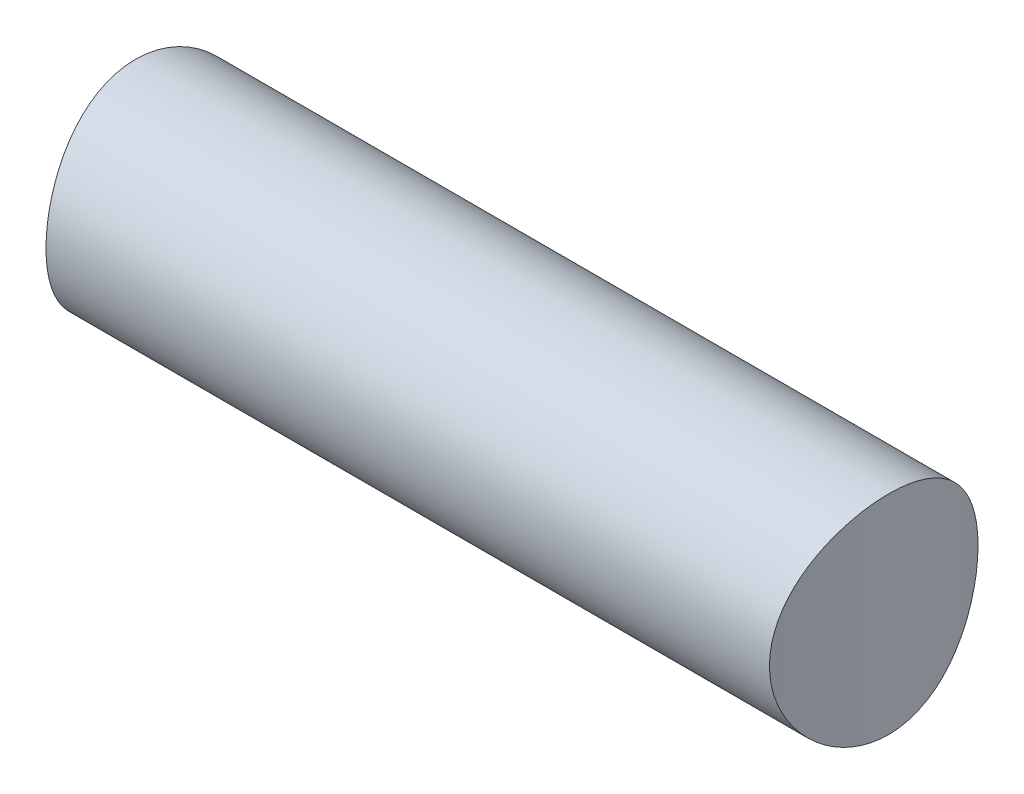
ISO-10303-21;
HEADER;
FILE_DESCRIPTION(('STEP AP214'),'2;1');
FILE_NAME('part.step','',(''),(''),'','','');
FILE_SCHEMA(('AUTOMOTIVE_DESIGN { 1 0 10303 214 1 1 1 1 }'));
ENDSEC;
DATA;
#1=APPLICATION_CONTEXT('core data for automotive mechanical design processes');
#2=APPLICATION_PROTOCOL_DEFINITION('international standard','automotive_design',2000,#1);
#3=PRODUCT_CONTEXT('',#1,'mechanical');
#4=PRODUCT('Part','Part','',(#3));
#5=PRODUCT_RELATED_PRODUCT_CATEGORY('part','',(#4));
#6=PRODUCT_DEFINITION_FORMATION('','',#4);
#7=PRODUCT_DEFINITION_CONTEXT('part definition',#1,'design');
#8=PRODUCT_DEFINITION('design','',#6,#7);
#9=PRODUCT_DEFINITION_SHAPE('','',#8);
#10=(LENGTH_UNIT() NAMED_UNIT(*) SI_UNIT(.MILLI.,.METRE.));
#11=(NAMED_UNIT(*) PLANE_ANGLE_UNIT() SI_UNIT($,.RADIAN.));
#12=(NAMED_UNIT(*) SI_UNIT($,.STERADIAN.) SOLID_ANGLE_UNIT());
#13=UNCERTAINTY_MEASURE_WITH_UNIT(LENGTH_MEASURE(1.E-05),#10,'distance_accuracy_value','');
#14=(GEOMETRIC_REPRESENTATION_CONTEXT(3) GLOBAL_UNCERTAINTY_ASSIGNED_CONTEXT((#13)) GLOBAL_UNIT_ASSIGNED_CONTEXT((#10,
#11,#12)) REPRESENTATION_CONTEXT('',''));
#15=CARTESIAN_POINT('',(0.,0.,0.));
#16=DIRECTION('',(0.,0.,1.));
#17=DIRECTION('',(1.,0.,0.));
#18=AXIS2_PLACEMENT_3D('',#15,#16,#17);
#19=CARTESIAN_POINT('',(0.,10.,0.));
#20=DIRECTION('',(0.,-1.,0.));
#21=DIRECTION('',(0.,0.,-1.));
#22=AXIS2_PLACEMENT_3D('',#19,#20,#21);
#23=CYLINDRICAL_SURFACE('',#22,6.86);
#24=CARTESIAN_POINT('',(6.59163105763665,6.,-1.9));
#25=CARTESIAN_POINT('',(6.59163270097938,5.89549675411097,-1.89999780628826));
#26=CARTESIAN_POINT('',(6.59414341831588,5.7909708853803,-1.89134884865616));
#27=CARTESIAN_POINT('',(6.60388204192961,5.58494893804559,-1.85705400342647));
#28=CARTESIAN_POINT('',(6.6111120741906,5.48345424650295,-1.83140045542376));
#29=CARTESIAN_POINT('',(6.62940905108194,5.28650524318556,-1.76401334032314));
#30=CARTESIAN_POINT('',(6.6404703083978,5.19104222460376,-1.72230359789532));
#31=CARTESIAN_POINT('',(6.66517603251171,5.00845102712002,-1.62406390289956));
#32=CARTESIAN_POINT('',(6.67882075710892,4.92132368132588,-1.56753247108727));
#33=CARTESIAN_POINT('',(6.70756858012531,4.75552676553505,-1.43962274245214));
#34=CARTESIAN_POINT('',(6.7226991343505,4.67711535735927,-1.36791591481302));
#35=CARTESIAN_POINT('',(6.75247755188823,4.53326339121352,-1.21239671623228));
#36=CARTESIAN_POINT('',(6.76712536162435,4.46782426893138,-1.12858300715263));
#37=CARTESIAN_POINT('',(6.79459590136706,4.35068474381495,-0.949425261970774));
#38=CARTESIAN_POINT('',(6.80738247729288,4.29924295270199,-0.853906110437325));
#39=CARTESIAN_POINT('',(6.82937364869001,4.21324824686219,-0.655160610743139));
#40=CARTESIAN_POINT('',(6.83857889765246,4.17869225065926,-0.551935672772083));
#41=CARTESIAN_POINT('',(6.85217605932241,4.12829116282743,-0.343405402984005));
#42=CARTESIAN_POINT('',(6.85668086978685,4.1120064594819,-0.238213815538595));
#43=CARTESIAN_POINT('',(6.86076516500632,4.09722505430859,-0.0265016647698278));
#44=CARTESIAN_POINT('',(6.86034553649985,4.09872514999138,0.0800186558392073));
#45=CARTESIAN_POINT('',(6.85471009137871,4.11916548160938,0.288297525531677));
#46=CARTESIAN_POINT('',(6.849624984268,4.13763044413227,0.390106799067252));
#47=CARTESIAN_POINT('',(6.8353855464955,4.19070600572513,0.589120842923308));
#48=CARTESIAN_POINT('',(6.82623097509955,4.22531755997258,0.686325340466112));
#49=CARTESIAN_POINT('',(6.80469128716685,4.31005522190625,0.874558845102859));
#50=CARTESIAN_POINT('',(6.79227331455028,4.36034014707596,0.965512442406674));
#51=CARTESIAN_POINT('',(6.76553875426084,4.47487422211408,1.13784960750763));
#52=CARTESIAN_POINT('',(6.75122177191448,4.53912627656617,1.21923117928734));
#53=CARTESIAN_POINT('',(6.72167678872466,4.68227692837269,1.37295156594626));
#54=CARTESIAN_POINT('',(6.7064343170473,4.76158936760136,1.44490268500078));
#55=CARTESIAN_POINT('',(6.67717923300929,4.93131036286249,1.57458209660795));
#56=CARTESIAN_POINT('',(6.66316670841156,5.02171970961299,1.63230937474825));
#57=CARTESIAN_POINT('',(6.63789645457466,5.21196166653103,1.73222908444405));
#58=CARTESIAN_POINT('',(6.62665900688494,5.31185666878068,1.77430821924232));
#59=CARTESIAN_POINT('',(6.60845913510955,5.51769375704647,1.84094388790987));
#60=CARTESIAN_POINT('',(6.60149555397248,5.62363419790225,1.86550516462979));
#61=CARTESIAN_POINT('',(6.59288062696182,5.83490971777278,1.89572300416723));
#62=CARTESIAN_POINT('',(6.59106590865885,5.94015503494451,1.90196118923126));
#63=CARTESIAN_POINT('',(6.59250574741807,6.15018660357655,1.89696476279126));
#64=CARTESIAN_POINT('',(6.59575971612763,6.25497290690154,1.88573217922338));
#65=CARTESIAN_POINT('',(6.60681170174123,6.4588170715195,1.84662747437641));
#66=CARTESIAN_POINT('',(6.61451216465538,6.55794921381925,1.8191122739205));
#67=CARTESIAN_POINT('',(6.6334924610799,6.75018936966331,1.7486283903445));
#68=CARTESIAN_POINT('',(6.64477278862129,6.84329654961018,1.70565757419839));
#69=CARTESIAN_POINT('',(6.66997157913765,7.02325705674668,1.60432481378773));
#70=CARTESIAN_POINT('',(6.68394574054422,7.10991234366487,1.54562534116918));
#71=CARTESIAN_POINT('',(6.71283011164992,7.27235616296461,1.41491460350266));
#72=CARTESIAN_POINT('',(6.7277405112528,7.34814248041269,1.34290063198415));
#73=CARTESIAN_POINT('',(6.75738542987701,7.48914967760174,1.18490152960302));
#74=CARTESIAN_POINT('',(6.7720996396994,7.55396290317516,1.09854798215039));
#75=CARTESIAN_POINT('',(6.79921537187427,7.6681778666128,0.91585239016395));
#76=CARTESIAN_POINT('',(6.81161701685985,7.71758042178379,0.81951087570438));
#77=CARTESIAN_POINT('',(6.83263049368621,7.79910695576067,0.620249738568718));
#78=CARTESIAN_POINT('',(6.8412708491535,7.83136140558953,0.517386652763912));
#79=CARTESIAN_POINT('',(6.85391403669584,7.87804407943939,0.307422992357073));
#80=CARTESIAN_POINT('',(6.85791798400952,7.89247659039358,0.200323443203792));
#81=CARTESIAN_POINT('',(6.86077997901154,7.90281971278765,-0.0112774013646374));
#82=CARTESIAN_POINT('',(6.85980356534407,7.89932613314726,-0.115747730555198));
#83=CARTESIAN_POINT('',(6.85319361290781,7.87531181114767,-0.322553980106251));
#84=CARTESIAN_POINT('',(6.84756027413939,7.85479180002033,-0.424889991935499));
#85=CARTESIAN_POINT('',(6.83230676456834,7.79765427813502,-0.623746394347944));
#86=CARTESIAN_POINT('',(6.82271864281594,7.76116603012611,-0.720306548859288));
#87=CARTESIAN_POINT('',(6.80055423780643,7.67324279470518,-0.905988635035887));
#88=CARTESIAN_POINT('',(6.78797751124361,7.62180558963186,-0.995109460558028));
#89=CARTESIAN_POINT('',(6.76073030042571,7.5037480447488,-1.16612234258723));
#90=CARTESIAN_POINT('',(6.74601059279286,7.43673883932652,-1.24773807033925));
#91=CARTESIAN_POINT('',(6.71632236064186,7.29016573251289,-1.39876744784632));
#92=CARTESIAN_POINT('',(6.7013537699788,7.21059844429374,-1.46817779518797));
#93=CARTESIAN_POINT('',(6.67244181840861,7.03884859934578,-1.59449986510806));
#94=CARTESIAN_POINT('',(6.65853210755754,6.94640698406785,-1.6510678073558));
#95=CARTESIAN_POINT('',(6.63380474676701,6.75295143548739,-1.74778214191845));
#96=CARTESIAN_POINT('',(6.62298522889167,6.65194272885392,-1.78793846095776));
#97=CARTESIAN_POINT('',(6.60703983247777,6.45953877823046,-1.8459108661542));
#98=CARTESIAN_POINT('',(6.60131052528726,6.36891515353853,-1.86614432976177));
#99=CARTESIAN_POINT('',(6.5936056637571,6.18553343452971,-1.8931889573846));
#100=CARTESIAN_POINT('',(6.59162959871391,6.09277563234899,-1.90000194752796));
#101=CARTESIAN_POINT('',(6.59163105763665,6.,-1.9));
#102=B_SPLINE_CURVE_WITH_KNOTS('',3,(#24,#25,#26,#27,#28,#29,#30,#31,#32,#33,#34,#35,#36,#37,
#38,#39,#40,#41,#42,#43,#44,#45,#46,#47,#48,#49,#50,#51,#52,#53,#54,#55,#56,#57,#58,#59,#60,#61,
#62,#63,#64,#65,#66,#67,#68,#69,#70,#71,#72,#73,#74,#75,#76,#77,#78,#79,#80,#81,#82,#83,#84,#85,
#86,#87,#88,#89,#90,#91,#92,#93,#94,#95,#96,#97,#98,#99,#100,#101),.UNSPECIFIED.,.T.,.F.,(4,2,2,
2,2,2,2,2,2,2,2,2,2,2,2,2,2,2,2,2,2,2,2,2,2,2,2,2,2,2,2,2,2,2,2,2,2,2,4),(0.,0.313168277823112,
0.626477730923763,0.93932406684453,1.25220163756171,1.57271145041281,1.89325671541606,
2.21937437720849,2.54543250378664,2.86346508879143,3.18144040688391,3.4907705752359,
3.80011904482995,4.11271003785846,4.42536609914521,4.74835412980139,5.07136518857512,
5.39667138983629,5.72188948300805,6.03666640281582,6.35140678731896,6.65949096415014,
6.96761767593369,7.28297539960527,7.59839729742632,7.92374766215918,8.24908076896101,
8.57190181710273,8.89464519793624,9.20673247669843,9.51880635298403,9.82839941845738,
10.1380384351849,10.4564497861005,10.7749471575488,11.1011655015915,11.4271862363352,
11.7052478315532,11.9832715882271),.UNSPECIFIED.);
#103=CARTESIAN_POINT('',(6.59163105763665,6.,-1.9));
#104=VERTEX_POINT('',#103);
#105=EDGE_CURVE('E42',#104,#104,#102,.T.);
#106=ORIENTED_EDGE('',*,*,#105,.F.);
#107=EDGE_LOOP('',(#106));
#108=FACE_BOUND('',#107,.T.);
#109=ADVANCED_FACE('F32',(#108),#23,.T.);
#110=CARTESIAN_POINT('',(-6.86,6.,0.));
#111=DIRECTION('',(1.,0.,0.));
#112=DIRECTION('',(0.,0.,-1.));
#113=AXIS2_PLACEMENT_3D('',#110,#111,#112);
#114=CYLINDRICAL_SURFACE('',#113,1.9);
#115=ORIENTED_EDGE('',*,*,#105,.T.);
#116=EDGE_LOOP('',(#115));
#117=FACE_BOUND('',#116,.T.);
#118=CARTESIAN_POINT('',(-6.86,4.1,0.));
#119=CARTESIAN_POINT('',(-6.85999858722013,4.10000215504828,-0.104590051644699));
#120=CARTESIAN_POINT('',(-6.85758472968204,4.10866498620979,-0.209202657619853));
#121=CARTESIAN_POINT('',(-6.8481901851718,4.14301992445033,-0.415404417640272));
#122=CARTESIAN_POINT('',(-6.8412075515675,4.16871929039841,-0.516992263618734));
#123=CARTESIAN_POINT('',(-6.8234445033766,4.23624026468239,-0.714139011354305));
#124=CARTESIAN_POINT('',(-6.81266920064352,4.27804017941767,-0.809705825004333));
#125=CARTESIAN_POINT('',(-6.78845392404178,4.37649270058396,-0.992473341961966));
#126=CARTESIAN_POINT('',(-6.77501371792442,4.43314660169192,-1.0796733151084));
#127=CARTESIAN_POINT('',(-6.74654111169647,4.56118433302339,-1.24539847034133));
#128=CARTESIAN_POINT('',(-6.73147983831169,4.6328690947818,-1.32368619444255));
#129=CARTESIAN_POINT('',(-6.70164397271748,4.78829098807034,-1.46729655045726));
#130=CARTESIAN_POINT('',(-6.68686942083691,4.87202980131994,-1.5326173702645));
#131=CARTESIAN_POINT('',(-6.65898156473122,5.0511118394496,-1.64962447348145));
#132=CARTESIAN_POINT('',(-6.64590453286827,5.14664293922237,-1.70103265478104));
#133=CARTESIAN_POINT('',(-6.62331899462443,5.34541375563565,-1.78696204001153));
#134=CARTESIAN_POINT('',(-6.61380977231891,5.4486519207688,-1.82148663226352));
#135=CARTESIAN_POINT('',(-6.59973545955365,5.65726504706799,-1.87183470279574));
#136=CARTESIAN_POINT('',(-6.59505618383984,5.76252766827778,-1.88809093257662));
#137=CARTESIAN_POINT('',(-6.59083083561345,5.9743820548923,-1.90279069419079));
#138=CARTESIAN_POINT('',(-6.59128372148095,6.08097354620381,-1.90123784054244));
#139=CARTESIAN_POINT('',(-6.59716962175827,6.28904128179645,-1.88070597927332));
#140=CARTESIAN_POINT('',(-6.60245144980221,6.39057469158811,-1.86225596431995));
#141=CARTESIAN_POINT('',(-6.61715728367617,6.5890451553746,-1.80930296288052));
#142=CARTESIAN_POINT('',(-6.62658164371479,6.68598181553738,-1.77479860364752));
#143=CARTESIAN_POINT('',(-6.6486398845323,6.87386053786348,-1.69029784515122));
#144=CARTESIAN_POINT('',(-6.66131099123597,6.96471651405561,-1.64012017193757));
#145=CARTESIAN_POINT('',(-6.68841563689987,7.1369021594991,-1.52582343983807));
#146=CARTESIAN_POINT('',(-6.70284954691815,7.21822981602115,-1.4617014435425));
#147=CARTESIAN_POINT('',(-6.73247800957591,7.37206631687515,-1.31865447859891));
#148=CARTESIAN_POINT('',(-6.74768142484504,7.44416239704761,-1.23928678317623));
#149=CARTESIAN_POINT('',(-6.77668047203929,7.57410941270837,-1.06940013419599));
#150=CARTESIAN_POINT('',(-6.7904760394699,7.63195969575803,-0.978880670186914));
#151=CARTESIAN_POINT('',(-6.81520125662484,7.731974731343,-0.788587977277973));
#152=CARTESIAN_POINT('',(-6.82611626643624,7.7740597971169,-0.688770838622147));
#153=CARTESIAN_POINT('',(-6.84374494155507,7.84073002233952,-0.483105675456709));
#154=CARTESIAN_POINT('',(-6.85045959972833,7.86531931757214,-0.377259082629433));
#155=CARTESIAN_POINT('',(-6.85877879513228,7.89564034544386,-0.166058115938683));
#156=CARTESIAN_POINT('',(-6.86053520603365,7.9019327098639,-0.0607900890122599));
#157=CARTESIAN_POINT('',(-6.85917930234349,7.89703638597928,0.149298898700573));
#158=CARTESIAN_POINT('',(-6.85606753384992,7.8858496584276,0.254119908309473));
#159=CARTESIAN_POINT('',(-6.8454234520855,7.84677081735517,0.458304190722703));
#160=CARTESIAN_POINT('',(-6.83797511131397,7.81919583738113,0.557732942702119));
#161=CARTESIAN_POINT('',(-6.81950712788993,7.74849544852237,0.750540304471289));
#162=CARTESIAN_POINT('',(-6.80848708360198,7.70536829074524,0.843918232432691));
#163=CARTESIAN_POINT('',(-6.78374768908357,7.60377764838176,1.02411755100512));
#164=CARTESIAN_POINT('',(-6.76997716023722,7.54501503058521,1.11076309378323));
#165=CARTESIAN_POINT('',(-6.74132611784192,7.41419369268489,1.27315882902037));
#166=CARTESIAN_POINT('',(-6.72644536764872,7.3421321330537,1.34890668849919));
#167=CARTESIAN_POINT('',(-6.6966847795064,7.18413540507006,1.48975185473358));
#168=CARTESIAN_POINT('',(-6.68181889889888,7.09784322462368,1.55445239962449));
#169=CARTESIAN_POINT('',(-6.65426668025668,6.91530817834538,1.66846885738791));
#170=CARTESIAN_POINT('',(-6.64158025820717,6.81906569631164,1.71778536335154));
#171=CARTESIAN_POINT('',(-6.61997113597432,6.61980395240326,1.79926660435887));
#172=CARTESIAN_POINT('',(-6.61102752601089,6.51682615969282,1.83152690056647));
#173=CARTESIAN_POINT('',(-6.59792603433667,6.3066142873145,1.87818276922649));
#174=CARTESIAN_POINT('',(-6.59376681036886,6.19938141014632,1.89258335230091));
#175=CARTESIAN_POINT('',(-6.59082329224871,5.98778235393528,1.90280649427529));
#176=CARTESIAN_POINT('',(-6.59185376034659,5.88344923887526,1.89926928213049));
#177=CARTESIAN_POINT('',(-6.59873633233529,5.67692939446989,1.8752151931377));
#178=CARTESIAN_POINT('',(-6.60458829305325,5.57474260148252,1.85469882048099));
#179=CARTESIAN_POINT('',(-6.62033988698841,5.37629319509305,1.79765314739266));
#180=CARTESIAN_POINT('',(-6.63020262837255,5.27998555224959,1.76126958084547));
#181=CARTESIAN_POINT('',(-6.65286291305646,5.09476672097632,1.67363505073891));
#182=CARTESIAN_POINT('',(-6.66566094888751,5.00585677726822,1.62238159168516));
#183=CARTESIAN_POINT('',(-6.69325408710002,4.83492613671386,1.50456451451755));
#184=CARTESIAN_POINT('',(-6.70809945951598,4.75321131550898,1.43756886061848));
#185=CARTESIAN_POINT('',(-6.73784542874088,4.60197603627264,1.29097764936374));
#186=CARTESIAN_POINT('',(-6.75274603830982,4.53245860169153,1.21137897728674));
#187=CARTESIAN_POINT('',(-6.78134497060899,4.40596959400253,1.03957286790152));
#188=CARTESIAN_POINT('',(-6.79500656912608,4.34933324686454,0.947111959286699));
#189=CARTESIAN_POINT('',(-6.8191759559901,4.25249580355508,0.753603834901252));
#190=CARTESIAN_POINT('',(-6.82968560874114,4.2122849864191,0.652561740549612));
#191=CARTESIAN_POINT('',(-6.84513687391659,4.15420547290522,0.460028973312807));
#192=CARTESIAN_POINT('',(-6.85066836016857,4.13392787245503,0.369305327576373));
#193=CARTESIAN_POINT('',(-6.85810033896638,4.10682496275222,0.185726882762707));
#194=CARTESIAN_POINT('',(-6.86000125449946,4.09999808639197,0.0928723332267212));
#195=CARTESIAN_POINT('',(-6.86,4.1,0.));
#196=B_SPLINE_CURVE_WITH_KNOTS('',3,(#118,#119,#120,#121,#122,#123,#124,#125,#126,#127,#128,
#129,#130,#131,#132,#133,#134,#135,#136,#137,#138,#139,#140,#141,#142,#143,#144,#145,#146,#147,
#148,#149,#150,#151,#152,#153,#154,#155,#156,#157,#158,#159,#160,#161,#162,#163,#164,#165,#166,
#167,#168,#169,#170,#171,#172,#173,#174,#175,#176,#177,#178,#179,#180,#181,#182,#183,#184,#185,
#186,#187,#188,#189,#190,#191,#192,#193,#194,#195),.UNSPECIFIED.,.T.,.F.,(4,2,2,2,2,2,2,2,2,2,2,
2,2,2,2,2,2,2,2,2,2,2,2,2,2,2,2,2,2,2,2,2,2,2,2,2,2,2,4),(0.,0.313429405719025,
0.626992442285331,0.940134459043744,1.2533037784121,1.57347288183003,1.89368669697049,
2.21989437039137,2.5460365511978,2.86427836299605,3.18245558581578,3.49100012854605,
3.79957105861571,4.11185195477011,4.42419869757955,4.74757382251473,5.07096375484932,
5.39596691548485,5.72089322384332,6.03575285922103,6.35057717710925,6.65949900367715,
6.96845558033656,7.28381099648506,7.59923382390198,7.92430709764513,8.24936783749454,
8.57258751850877,8.89571649827472,9.20739542830542,9.51906510345212,9.82793059416972,
10.1368479493102,10.4555121097206,10.7742551483642,11.100529085026,11.4266096453599,
11.7049565029329,11.983270929145),.UNSPECIFIED.);
#197=CARTESIAN_POINT('',(-6.86,4.1,0.));
#198=VERTEX_POINT('',#197);
#199=EDGE_CURVE('E11',#198,#198,#196,.T.);
#200=ORIENTED_EDGE('',*,*,#199,.T.);
#201=EDGE_LOOP('',(#200));
#202=FACE_BOUND('',#201,.T.);
#203=ADVANCED_FACE('F50',(#117,#202),#114,.T.);
#204=ORIENTED_EDGE('',*,*,#199,.F.);
#205=EDGE_LOOP('',(#204));
#206=FACE_BOUND('',#205,.T.);
#207=ADVANCED_FACE('F34',(#206),#23,.T.);
#208=CLOSED_SHELL('',(#109,#203,#207));
#209=MANIFOLD_SOLID_BREP('B2',#208);
#210=ADVANCED_BREP_SHAPE_REPRESENTATION('',(#18,#209),#14);
#211=SHAPE_DEFINITION_REPRESENTATION(#9,#210);
ENDSEC;
END-ISO-10303-21;
